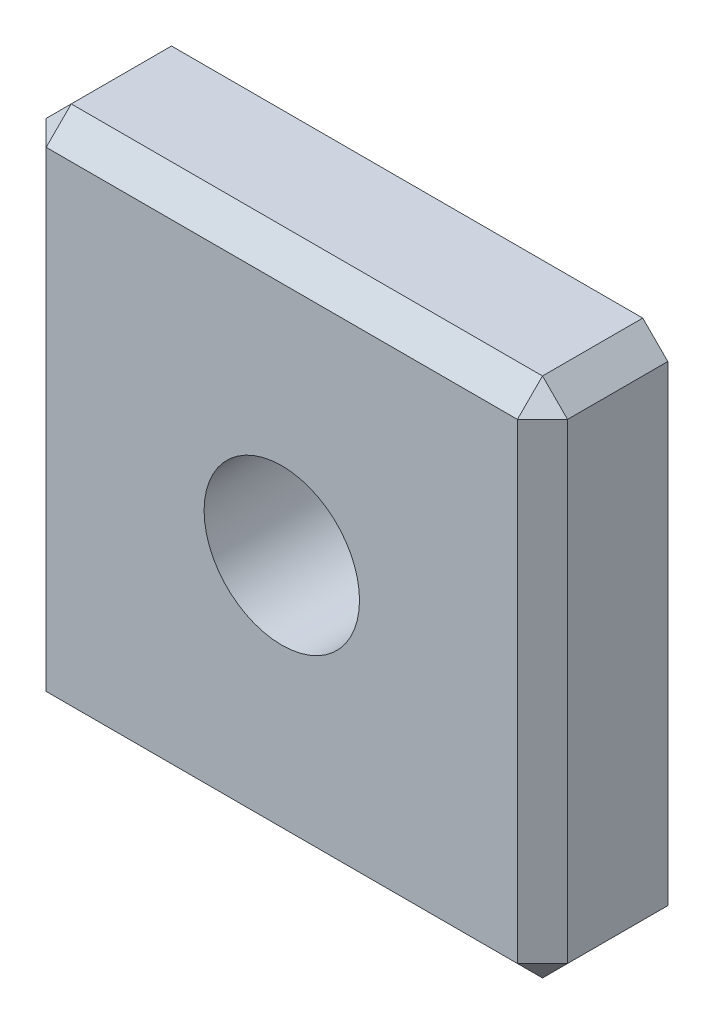
ISO-10303-21;
HEADER;
FILE_DESCRIPTION(('STEP AP214'),'2;1');
FILE_NAME('part.step','',(''),(''),'','','');
FILE_SCHEMA(('AUTOMOTIVE_DESIGN { 1 0 10303 214 1 1 1 1 }'));
ENDSEC;
DATA;
#1=APPLICATION_CONTEXT('core data for automotive mechanical design processes');
#2=APPLICATION_PROTOCOL_DEFINITION('international standard','automotive_design',2000,#1);
#3=PRODUCT_CONTEXT('',#1,'mechanical');
#4=PRODUCT('Part','Part','',(#3));
#5=PRODUCT_RELATED_PRODUCT_CATEGORY('part','',(#4));
#6=PRODUCT_DEFINITION_FORMATION('','',#4);
#7=PRODUCT_DEFINITION_CONTEXT('part definition',#1,'design');
#8=PRODUCT_DEFINITION('design','',#6,#7);
#9=PRODUCT_DEFINITION_SHAPE('','',#8);
#10=(LENGTH_UNIT() NAMED_UNIT(*) SI_UNIT(.MILLI.,.METRE.));
#11=(NAMED_UNIT(*) PLANE_ANGLE_UNIT() SI_UNIT($,.RADIAN.));
#12=(NAMED_UNIT(*) SI_UNIT($,.STERADIAN.) SOLID_ANGLE_UNIT());
#13=UNCERTAINTY_MEASURE_WITH_UNIT(LENGTH_MEASURE(1.E-05),#10,'distance_accuracy_value','');
#14=(GEOMETRIC_REPRESENTATION_CONTEXT(3) GLOBAL_UNCERTAINTY_ASSIGNED_CONTEXT((#13)) GLOBAL_UNIT_ASSIGNED_CONTEXT((#10,
#11,#12)) REPRESENTATION_CONTEXT('',''));
#15=CARTESIAN_POINT('',(0.,0.,0.));
#16=DIRECTION('',(0.,0.,1.));
#17=DIRECTION('',(1.,0.,0.));
#18=AXIS2_PLACEMENT_3D('',#15,#16,#17);
#19=CARTESIAN_POINT('',(0.,0.,5.));
#20=DIRECTION('',(1.,0.,0.));
#21=DIRECTION('',(0.,0.,-1.));
#22=AXIS2_PLACEMENT_3D('',#19,#20,#21);
#23=PLANE('',#22);
#24=DIRECTION('',(0.,1.,0.));
#25=VECTOR('',#24,1.);
#26=CARTESIAN_POINT('',(0.,0.,4.));
#27=LINE('',#26,#25);
#28=CARTESIAN_POINT('',(0.,1.,4.));
#29=VERTEX_POINT('',#28);
#30=CARTESIAN_POINT('',(0.,19.8,4.));
#31=VERTEX_POINT('',#30);
#32=EDGE_CURVE('E130',#29,#31,#27,.T.);
#33=ORIENTED_EDGE('',*,*,#32,.T.);
#34=DIRECTION('',(0.,0.,-1.));
#35=VECTOR('',#34,1.);
#36=CARTESIAN_POINT('',(0.,19.8,5.));
#37=LINE('',#36,#35);
#38=CARTESIAN_POINT('',(0.,19.8,0.));
#39=VERTEX_POINT('',#38);
#40=EDGE_CURVE('E116',#31,#39,#37,.T.);
#41=ORIENTED_EDGE('',*,*,#40,.T.);
#42=DIRECTION('',(0.,-1.,0.));
#43=VECTOR('',#42,1.);
#44=CARTESIAN_POINT('',(0.,0.,0.));
#45=LINE('',#44,#43);
#46=CARTESIAN_POINT('',(0.,1.,0.));
#47=VERTEX_POINT('',#46);
#48=EDGE_CURVE('E127',#39,#47,#45,.T.);
#49=ORIENTED_EDGE('',*,*,#48,.T.);
#50=DIRECTION('',(0.,0.,1.));
#51=VECTOR('',#50,1.);
#52=CARTESIAN_POINT('',(0.,1.,5.));
#53=LINE('',#52,#51);
#54=EDGE_CURVE('E133',#47,#29,#53,.T.);
#55=ORIENTED_EDGE('',*,*,#54,.T.);
#56=EDGE_LOOP('',(#33,#41,#49,#55));
#57=FACE_BOUND('',#56,.T.);
#58=ADVANCED_FACE('F34',(#57),#23,.F.);
#59=CARTESIAN_POINT('',(0.,0.,5.));
#60=DIRECTION('',(0.,1.,0.));
#61=DIRECTION('',(0.,0.,1.));
#62=AXIS2_PLACEMENT_3D('',#59,#60,#61);
#63=PLANE('',#62);
#64=DIRECTION('',(1.,0.,0.));
#65=VECTOR('',#64,1.);
#66=CARTESIAN_POINT('',(0.,0.,0.));
#67=LINE('',#66,#65);
#68=CARTESIAN_POINT('',(1.,0.,0.));
#69=VERTEX_POINT('',#68);
#70=CARTESIAN_POINT('',(19.8,0.,0.));
#71=VERTEX_POINT('',#70);
#72=EDGE_CURVE('E138',#69,#71,#67,.T.);
#73=ORIENTED_EDGE('',*,*,#72,.T.);
#74=DIRECTION('',(0.,0.,1.));
#75=VECTOR('',#74,1.);
#76=CARTESIAN_POINT('',(19.8,0.,5.));
#77=LINE('',#76,#75);
#78=CARTESIAN_POINT('',(19.8,0.,4.));
#79=VERTEX_POINT('',#78);
#80=EDGE_CURVE('E173',#71,#79,#77,.T.);
#81=ORIENTED_EDGE('',*,*,#80,.T.);
#82=DIRECTION('',(-1.,0.,0.));
#83=VECTOR('',#82,1.);
#84=CARTESIAN_POINT('',(0.,0.,4.));
#85=LINE('',#84,#83);
#86=CARTESIAN_POINT('',(1.,0.,4.));
#87=VERTEX_POINT('',#86);
#88=EDGE_CURVE('E169',#79,#87,#85,.T.);
#89=ORIENTED_EDGE('',*,*,#88,.T.);
#90=DIRECTION('',(0.,0.,-1.));
#91=VECTOR('',#90,1.);
#92=CARTESIAN_POINT('',(1.,0.,5.));
#93=LINE('',#92,#91);
#94=EDGE_CURVE('E171',#87,#69,#93,.T.);
#95=ORIENTED_EDGE('',*,*,#94,.T.);
#96=EDGE_LOOP('',(#73,#81,#89,#95));
#97=FACE_BOUND('',#96,.T.);
#98=ADVANCED_FACE('F237',(#97),#63,.F.);
#99=CARTESIAN_POINT('',(20.8,0.,5.));
#100=DIRECTION('',(-1.,0.,0.));
#101=DIRECTION('',(0.,0.,1.));
#102=AXIS2_PLACEMENT_3D('',#99,#100,#101);
#103=PLANE('',#102);
#104=DIRECTION('',(0.,1.,0.));
#105=VECTOR('',#104,1.);
#106=CARTESIAN_POINT('',(20.8,0.,0.));
#107=LINE('',#106,#105);
#108=CARTESIAN_POINT('',(20.8,1.,0.));
#109=VERTEX_POINT('',#108);
#110=CARTESIAN_POINT('',(20.8,19.8,0.));
#111=VERTEX_POINT('',#110);
#112=EDGE_CURVE('E142',#109,#111,#107,.T.);
#113=ORIENTED_EDGE('',*,*,#112,.T.);
#114=DIRECTION('',(0.,0.,1.));
#115=VECTOR('',#114,1.);
#116=CARTESIAN_POINT('',(20.8,19.8,5.));
#117=LINE('',#116,#115);
#118=CARTESIAN_POINT('',(20.8,19.8,4.));
#119=VERTEX_POINT('',#118);
#120=EDGE_CURVE('E167',#111,#119,#117,.T.);
#121=ORIENTED_EDGE('',*,*,#120,.T.);
#122=DIRECTION('',(0.,-1.,0.));
#123=VECTOR('',#122,1.);
#124=CARTESIAN_POINT('',(20.8,0.,4.));
#125=LINE('',#124,#123);
#126=CARTESIAN_POINT('',(20.8,1.,4.));
#127=VERTEX_POINT('',#126);
#128=EDGE_CURVE('E163',#119,#127,#125,.T.);
#129=ORIENTED_EDGE('',*,*,#128,.T.);
#130=DIRECTION('',(0.,0.,-1.));
#131=VECTOR('',#130,1.);
#132=CARTESIAN_POINT('',(20.8,1.,5.));
#133=LINE('',#132,#131);
#134=EDGE_CURVE('E165',#127,#109,#133,.T.);
#135=ORIENTED_EDGE('',*,*,#134,.T.);
#136=EDGE_LOOP('',(#113,#121,#129,#135));
#137=FACE_BOUND('',#136,.T.);
#138=ADVANCED_FACE('F233',(#137),#103,.F.);
#139=CARTESIAN_POINT('',(0.,20.8,5.));
#140=DIRECTION('',(0.,-1.,0.));
#141=DIRECTION('',(0.,0.,-1.));
#142=AXIS2_PLACEMENT_3D('',#139,#140,#141);
#143=PLANE('',#142);
#144=DIRECTION('',(-1.,0.,0.));
#145=VECTOR('',#144,1.);
#146=CARTESIAN_POINT('',(0.,20.8,0.));
#147=LINE('',#146,#145);
#148=CARTESIAN_POINT('',(19.8,20.8,0.));
#149=VERTEX_POINT('',#148);
#150=CARTESIAN_POINT('',(1.,20.8,0.));
#151=VERTEX_POINT('',#150);
#152=EDGE_CURVE('E151',#149,#151,#147,.T.);
#153=ORIENTED_EDGE('',*,*,#152,.T.);
#154=DIRECTION('',(0.,0.,1.));
#155=VECTOR('',#154,1.);
#156=CARTESIAN_POINT('',(1.,20.8,5.));
#157=LINE('',#156,#155);
#158=CARTESIAN_POINT('',(1.,20.8,4.));
#159=VERTEX_POINT('',#158);
#160=EDGE_CURVE('E117',#151,#159,#157,.T.);
#161=ORIENTED_EDGE('',*,*,#160,.T.);
#162=DIRECTION('',(1.,0.,0.));
#163=VECTOR('',#162,1.);
#164=CARTESIAN_POINT('',(0.,20.8,4.));
#165=LINE('',#164,#163);
#166=CARTESIAN_POINT('',(19.8,20.8,4.));
#167=VERTEX_POINT('',#166);
#168=EDGE_CURVE('E122',#159,#167,#165,.T.);
#169=ORIENTED_EDGE('',*,*,#168,.T.);
#170=DIRECTION('',(0.,0.,-1.));
#171=VECTOR('',#170,1.);
#172=CARTESIAN_POINT('',(19.8,20.8,5.));
#173=LINE('',#172,#171);
#174=EDGE_CURVE('E160',#167,#149,#173,.T.);
#175=ORIENTED_EDGE('',*,*,#174,.T.);
#176=EDGE_LOOP('',(#153,#161,#169,#175));
#177=FACE_BOUND('',#176,.T.);
#178=ADVANCED_FACE('F226',(#177),#143,.F.);
#179=CARTESIAN_POINT('',(0.,0.,5.));
#180=DIRECTION('',(0.,0.,-1.));
#181=DIRECTION('',(-1.,0.,0.));
#182=AXIS2_PLACEMENT_3D('',#179,#180,#181);
#183=PLANE('',#182);
#184=DIRECTION('',(0.,1.,0.));
#185=VECTOR('',#184,1.);
#186=CARTESIAN_POINT('',(19.8,0.,5.));
#187=LINE('',#186,#185);
#188=CARTESIAN_POINT('',(19.8,1.,5.));
#189=VERTEX_POINT('',#188);
#190=CARTESIAN_POINT('',(19.8,19.8,5.));
#191=VERTEX_POINT('',#190);
#192=EDGE_CURVE('E44',#189,#191,#187,.T.);
#193=ORIENTED_EDGE('',*,*,#192,.T.);
#194=DIRECTION('',(-1.,0.,0.));
#195=VECTOR('',#194,1.);
#196=CARTESIAN_POINT('',(0.,19.8,5.));
#197=LINE('',#196,#195);
#198=CARTESIAN_POINT('',(1.,19.8,5.));
#199=VERTEX_POINT('',#198);
#200=EDGE_CURVE('E11',#191,#199,#197,.T.);
#201=ORIENTED_EDGE('',*,*,#200,.T.);
#202=DIRECTION('',(0.,-1.,0.));
#203=VECTOR('',#202,1.);
#204=CARTESIAN_POINT('',(1.,0.,5.));
#205=LINE('',#204,#203);
#206=CARTESIAN_POINT('',(1.,1.,5.));
#207=VERTEX_POINT('',#206);
#208=EDGE_CURVE('E175',#199,#207,#205,.T.);
#209=ORIENTED_EDGE('',*,*,#208,.T.);
#210=DIRECTION('',(1.,0.,0.));
#211=VECTOR('',#210,1.);
#212=CARTESIAN_POINT('',(0.,1.,5.));
#213=LINE('',#212,#211);
#214=EDGE_CURVE('E55',#207,#189,#213,.T.);
#215=ORIENTED_EDGE('',*,*,#214,.T.);
#216=EDGE_LOOP('',(#193,#201,#209,#215));
#217=FACE_BOUND('',#216,.T.);
#218=CARTESIAN_POINT('',(10.4,10.4,5.));
#219=DIRECTION('',(0.,0.,-1.));
#220=DIRECTION('',(-1.,0.,0.));
#221=AXIS2_PLACEMENT_3D('',#218,#219,#220);
#222=CIRCLE('',#221,3.1);
#223=CARTESIAN_POINT('',(7.3,10.4,5.));
#224=VERTEX_POINT('',#223);
#225=EDGE_CURVE('E139',#224,#224,#222,.T.);
#226=ORIENTED_EDGE('',*,*,#225,.T.);
#227=EDGE_LOOP('',(#226));
#228=FACE_BOUND('',#227,.T.);
#229=ADVANCED_FACE('F224',(#217,#228),#183,.F.);
#230=CARTESIAN_POINT('',(0.,0.,0.));
#231=DIRECTION('',(0.,0.,-1.));
#232=DIRECTION('',(-1.,0.,0.));
#233=AXIS2_PLACEMENT_3D('',#230,#231,#232);
#234=PLANE('',#233);
#235=CARTESIAN_POINT('',(10.4,10.4,0.));
#236=DIRECTION('',(0.,0.,1.));
#237=DIRECTION('',(1.,0.,0.));
#238=AXIS2_PLACEMENT_3D('',#235,#236,#237);
#239=CIRCLE('',#238,3.1);
#240=CARTESIAN_POINT('',(13.5,10.4,0.));
#241=VERTEX_POINT('',#240);
#242=EDGE_CURVE('E145',#241,#241,#239,.T.);
#243=ORIENTED_EDGE('',*,*,#242,.T.);
#244=EDGE_LOOP('',(#243));
#245=FACE_BOUND('',#244,.T.);
#246=ORIENTED_EDGE('',*,*,#48,.F.);
#247=DIRECTION('',(-0.707106781186546,-0.707106781186549,0.));
#248=VECTOR('',#247,1.);
#249=CARTESIAN_POINT('',(-9.9,9.89999999999996,0.));
#250=LINE('',#249,#248);
#251=EDGE_CURVE('E112',#39,#151,#250,.F.);
#252=ORIENTED_EDGE('',*,*,#251,.T.);
#253=ORIENTED_EDGE('',*,*,#152,.F.);
#254=DIRECTION('',(-0.707106781186546,0.707106781186549,0.));
#255=VECTOR('',#254,1.);
#256=CARTESIAN_POINT('',(20.3,20.3,0.));
#257=LINE('',#256,#255);
#258=EDGE_CURVE('E123',#149,#111,#257,.F.);
#259=ORIENTED_EDGE('',*,*,#258,.T.);
#260=ORIENTED_EDGE('',*,*,#112,.F.);
#261=DIRECTION('',(0.707106781186549,0.707106781186546,0.));
#262=VECTOR('',#261,1.);
#263=CARTESIAN_POINT('',(9.89999999999996,-9.9,0.));
#264=LINE('',#263,#262);
#265=EDGE_CURVE('E156',#109,#71,#264,.F.);
#266=ORIENTED_EDGE('',*,*,#265,.T.);
#267=ORIENTED_EDGE('',*,*,#72,.F.);
#268=DIRECTION('',(0.707106781186546,-0.707106781186549,0.));
#269=VECTOR('',#268,1.);
#270=CARTESIAN_POINT('',(0.500000000000002,0.500000000000001,0.));
#271=LINE('',#270,#269);
#272=EDGE_CURVE('E132',#69,#47,#271,.F.);
#273=ORIENTED_EDGE('',*,*,#272,.T.);
#274=EDGE_LOOP('',(#246,#252,#253,#259,#260,#266,#267,#273));
#275=FACE_BOUND('',#274,.T.);
#276=ADVANCED_FACE('F135',(#245,#275),#234,.T.);
#277=CARTESIAN_POINT('',(10.4,10.4,0.));
#278=DIRECTION('',(0.,0.,1.));
#279=DIRECTION('',(1.,0.,0.));
#280=AXIS2_PLACEMENT_3D('',#277,#278,#279);
#281=CYLINDRICAL_SURFACE('',#280,3.1);
#282=ORIENTED_EDGE('',*,*,#242,.F.);
#283=EDGE_LOOP('',(#282));
#284=FACE_BOUND('',#283,.T.);
#285=ORIENTED_EDGE('',*,*,#225,.F.);
#286=EDGE_LOOP('',(#285));
#287=FACE_BOUND('',#286,.T.);
#288=ADVANCED_FACE('F218',(#284,#287),#281,.F.);
#289=CARTESIAN_POINT('',(20.8,1.,5.));
#290=DIRECTION('',(-0.707106781186546,0.707106781186549,0.));
#291=DIRECTION('',(0.,0.,-1.));
#292=AXIS2_PLACEMENT_3D('',#289,#290,#291);
#293=PLANE('',#292);
#294=DIRECTION('',(-0.707106781186549,-0.707106781186546,0.));
#295=VECTOR('',#294,1.);
#296=CARTESIAN_POINT('',(19.8,0.,4.));
#297=LINE('',#296,#295);
#298=EDGE_CURVE('E39',#79,#127,#297,.F.);
#299=ORIENTED_EDGE('',*,*,#298,.F.);
#300=ORIENTED_EDGE('',*,*,#80,.F.);
#301=ORIENTED_EDGE('',*,*,#265,.F.);
#302=ORIENTED_EDGE('',*,*,#134,.F.);
#303=EDGE_LOOP('',(#299,#300,#301,#302));
#304=FACE_BOUND('',#303,.T.);
#305=ADVANCED_FACE('F37',(#304),#293,.F.);
#306=CARTESIAN_POINT('',(19.8,0.,4.));
#307=DIRECTION('',(0.577350269189626,-0.577350269189628,0.577350269189624));
#308=DIRECTION('',(0.707106781186549,0.707106781186546,0.));
#309=AXIS2_PLACEMENT_3D('',#306,#307,#308);
#310=PLANE('',#309);
#311=DIRECTION('',(0.,0.707106781186546,0.707106781186549));
#312=VECTOR('',#311,1.);
#313=CARTESIAN_POINT('',(19.8,0.,4.));
#314=LINE('',#313,#312);
#315=EDGE_CURVE('E204',#79,#189,#314,.T.);
#316=ORIENTED_EDGE('',*,*,#315,.F.);
#317=ORIENTED_EDGE('',*,*,#298,.T.);
#318=DIRECTION('',(0.707106781186546,0.,-0.707106781186549));
#319=VECTOR('',#318,1.);
#320=CARTESIAN_POINT('',(20.3,1.,4.5));
#321=LINE('',#320,#319);
#322=EDGE_CURVE('E205',#189,#127,#321,.T.);
#323=ORIENTED_EDGE('',*,*,#322,.F.);
#324=EDGE_LOOP('',(#316,#317,#323));
#325=FACE_BOUND('',#324,.T.);
#326=ADVANCED_FACE('F312',(#325),#310,.T.);
#327=CARTESIAN_POINT('',(19.8,20.8,5.));
#328=DIRECTION('',(-0.707106781186549,-0.707106781186546,0.));
#329=DIRECTION('',(0.,0.,-1.));
#330=AXIS2_PLACEMENT_3D('',#327,#328,#329);
#331=PLANE('',#330);
#332=ORIENTED_EDGE('',*,*,#258,.F.);
#333=ORIENTED_EDGE('',*,*,#174,.F.);
#334=DIRECTION('',(0.707106781186546,-0.707106781186549,0.));
#335=VECTOR('',#334,1.);
#336=CARTESIAN_POINT('',(20.8,19.8,4.));
#337=LINE('',#336,#335);
#338=EDGE_CURVE('E201',#119,#167,#337,.F.);
#339=ORIENTED_EDGE('',*,*,#338,.F.);
#340=ORIENTED_EDGE('',*,*,#120,.F.);
#341=EDGE_LOOP('',(#332,#333,#339,#340));
#342=FACE_BOUND('',#341,.T.);
#343=ADVANCED_FACE('F307',(#342),#331,.F.);
#344=CARTESIAN_POINT('',(19.8,0.,5.));
#345=DIRECTION('',(-0.707106781186549,0.,-0.707106781186546));
#346=DIRECTION('',(0.,1.,0.));
#347=AXIS2_PLACEMENT_3D('',#344,#345,#346);
#348=PLANE('',#347);
#349=ORIENTED_EDGE('',*,*,#322,.T.);
#350=ORIENTED_EDGE('',*,*,#128,.F.);
#351=DIRECTION('',(-0.707106781186546,0.,0.707106781186549));
#352=VECTOR('',#351,1.);
#353=CARTESIAN_POINT('',(20.8,19.8,4.));
#354=LINE('',#353,#352);
#355=EDGE_CURVE('E198',#191,#119,#354,.F.);
#356=ORIENTED_EDGE('',*,*,#355,.F.);
#357=ORIENTED_EDGE('',*,*,#192,.F.);
#358=EDGE_LOOP('',(#349,#350,#356,#357));
#359=FACE_BOUND('',#358,.T.);
#360=ADVANCED_FACE('F300',(#359),#348,.F.);
#361=CARTESIAN_POINT('',(0.,1.,5.));
#362=DIRECTION('',(0.,0.707106781186549,-0.707106781186546));
#363=DIRECTION('',(1.,0.,0.));
#364=AXIS2_PLACEMENT_3D('',#361,#362,#363);
#365=PLANE('',#364);
#366=ORIENTED_EDGE('',*,*,#315,.T.);
#367=ORIENTED_EDGE('',*,*,#214,.F.);
#368=DIRECTION('',(0.,-0.707106781186546,-0.707106781186549));
#369=VECTOR('',#368,1.);
#370=CARTESIAN_POINT('',(1.,0.5,4.5));
#371=LINE('',#370,#369);
#372=EDGE_CURVE('E195',#87,#207,#371,.F.);
#373=ORIENTED_EDGE('',*,*,#372,.F.);
#374=ORIENTED_EDGE('',*,*,#88,.F.);
#375=EDGE_LOOP('',(#366,#367,#373,#374));
#376=FACE_BOUND('',#375,.T.);
#377=ADVANCED_FACE('F293',(#376),#365,.F.);
#378=CARTESIAN_POINT('',(1.,0.,5.));
#379=DIRECTION('',(0.707106781186549,0.707106781186546,0.));
#380=DIRECTION('',(0.,0.,-1.));
#381=AXIS2_PLACEMENT_3D('',#378,#379,#380);
#382=PLANE('',#381);
#383=ORIENTED_EDGE('',*,*,#272,.F.);
#384=ORIENTED_EDGE('',*,*,#94,.F.);
#385=DIRECTION('',(-0.707106781186546,0.707106781186549,0.));
#386=VECTOR('',#385,1.);
#387=CARTESIAN_POINT('',(0.,1.,4.));
#388=LINE('',#387,#386);
#389=EDGE_CURVE('E192',#29,#87,#388,.F.);
#390=ORIENTED_EDGE('',*,*,#389,.F.);
#391=ORIENTED_EDGE('',*,*,#54,.F.);
#392=EDGE_LOOP('',(#383,#384,#390,#391));
#393=FACE_BOUND('',#392,.T.);
#394=ADVANCED_FACE('F286',(#393),#382,.F.);
#395=CARTESIAN_POINT('',(20.8,19.8,4.));
#396=DIRECTION('',(0.577350269189628,0.577350269189626,0.577350269189624));
#397=DIRECTION('',(-0.707106781186546,0.707106781186549,0.));
#398=AXIS2_PLACEMENT_3D('',#395,#396,#397);
#399=PLANE('',#398);
#400=ORIENTED_EDGE('',*,*,#355,.T.);
#401=ORIENTED_EDGE('',*,*,#338,.T.);
#402=DIRECTION('',(0.,0.707106781186546,-0.707106781186549));
#403=VECTOR('',#402,1.);
#404=CARTESIAN_POINT('',(19.8,20.3,4.5));
#405=LINE('',#404,#403);
#406=EDGE_CURVE('E189',#191,#167,#405,.T.);
#407=ORIENTED_EDGE('',*,*,#406,.F.);
#408=EDGE_LOOP('',(#400,#401,#407));
#409=FACE_BOUND('',#408,.T.);
#410=ADVANCED_FACE('F279',(#409),#399,.T.);
#411=CARTESIAN_POINT('',(0.,1.,4.));
#412=DIRECTION('',(-0.577350269189628,-0.577350269189626,0.577350269189624));
#413=DIRECTION('',(0.707106781186546,-0.707106781186549,0.));
#414=AXIS2_PLACEMENT_3D('',#411,#412,#413);
#415=PLANE('',#414);
#416=ORIENTED_EDGE('',*,*,#389,.T.);
#417=ORIENTED_EDGE('',*,*,#372,.T.);
#418=DIRECTION('',(0.707106781186546,0.,0.707106781186549));
#419=VECTOR('',#418,1.);
#420=CARTESIAN_POINT('',(0.,1.,4.));
#421=LINE('',#420,#419);
#422=EDGE_CURVE('E186',#29,#207,#421,.T.);
#423=ORIENTED_EDGE('',*,*,#422,.F.);
#424=EDGE_LOOP('',(#416,#417,#423));
#425=FACE_BOUND('',#424,.T.);
#426=ADVANCED_FACE('F272',(#425),#415,.T.);
#427=CARTESIAN_POINT('',(0.,19.8,5.));
#428=DIRECTION('',(0.,-0.707106781186549,-0.707106781186546));
#429=DIRECTION('',(-1.,0.,0.));
#430=AXIS2_PLACEMENT_3D('',#427,#428,#429);
#431=PLANE('',#430);
#432=ORIENTED_EDGE('',*,*,#406,.T.);
#433=ORIENTED_EDGE('',*,*,#168,.F.);
#434=DIRECTION('',(0.,-0.707106781186546,0.707106781186549));
#435=VECTOR('',#434,1.);
#436=CARTESIAN_POINT('',(1.,20.8,4.));
#437=LINE('',#436,#435);
#438=EDGE_CURVE('E183',#199,#159,#437,.F.);
#439=ORIENTED_EDGE('',*,*,#438,.F.);
#440=ORIENTED_EDGE('',*,*,#200,.F.);
#441=EDGE_LOOP('',(#432,#433,#439,#440));
#442=FACE_BOUND('',#441,.T.);
#443=ADVANCED_FACE('F265',(#442),#431,.F.);
#444=CARTESIAN_POINT('',(1.,0.,5.));
#445=DIRECTION('',(0.707106781186549,0.,-0.707106781186546));
#446=DIRECTION('',(0.,-1.,0.));
#447=AXIS2_PLACEMENT_3D('',#444,#445,#446);
#448=PLANE('',#447);
#449=ORIENTED_EDGE('',*,*,#422,.T.);
#450=ORIENTED_EDGE('',*,*,#208,.F.);
#451=DIRECTION('',(-0.707106781186546,0.,-0.707106781186549));
#452=VECTOR('',#451,1.);
#453=CARTESIAN_POINT('',(0.500000000000001,19.8,4.5));
#454=LINE('',#453,#452);
#455=EDGE_CURVE('E181',#31,#199,#454,.F.);
#456=ORIENTED_EDGE('',*,*,#455,.F.);
#457=ORIENTED_EDGE('',*,*,#32,.F.);
#458=EDGE_LOOP('',(#449,#450,#456,#457));
#459=FACE_BOUND('',#458,.T.);
#460=ADVANCED_FACE('F258',(#459),#448,.F.);
#461=CARTESIAN_POINT('',(1.,20.8,4.));
#462=DIRECTION('',(-0.577350269189628,0.577350269189626,0.577350269189624));
#463=DIRECTION('',(-0.707106781186546,-0.707106781186549,0.));
#464=AXIS2_PLACEMENT_3D('',#461,#462,#463);
#465=PLANE('',#464);
#466=ORIENTED_EDGE('',*,*,#455,.T.);
#467=ORIENTED_EDGE('',*,*,#438,.T.);
#468=DIRECTION('',(0.707106781186546,0.707106781186549,0.));
#469=VECTOR('',#468,1.);
#470=CARTESIAN_POINT('',(1.,20.8,4.));
#471=LINE('',#470,#469);
#472=EDGE_CURVE('E179',#31,#159,#471,.T.);
#473=ORIENTED_EDGE('',*,*,#472,.F.);
#474=EDGE_LOOP('',(#466,#467,#473));
#475=FACE_BOUND('',#474,.T.);
#476=ADVANCED_FACE('F252',(#475),#465,.T.);
#477=CARTESIAN_POINT('',(0.,19.8,5.));
#478=DIRECTION('',(0.707106781186549,-0.707106781186546,0.));
#479=DIRECTION('',(0.,0.,-1.));
#480=AXIS2_PLACEMENT_3D('',#477,#478,#479);
#481=PLANE('',#480);
#482=ORIENTED_EDGE('',*,*,#472,.T.);
#483=ORIENTED_EDGE('',*,*,#160,.F.);
#484=ORIENTED_EDGE('',*,*,#251,.F.);
#485=ORIENTED_EDGE('',*,*,#40,.F.);
#486=EDGE_LOOP('',(#482,#483,#484,#485));
#487=FACE_BOUND('',#486,.T.);
#488=ADVANCED_FACE('F115',(#487),#481,.F.);
#489=CLOSED_SHELL('',(#58,#98,#138,#178,#229,#276,#288,#305,#326,#343,#360,#377,#394,#410,#426,
#443,#460,#476,#488));
#490=MANIFOLD_SOLID_BREP('B2',#489);
#491=ADVANCED_BREP_SHAPE_REPRESENTATION('',(#18,#490),#14);
#492=SHAPE_DEFINITION_REPRESENTATION(#9,#491);
ENDSEC;
END-ISO-10303-21;
